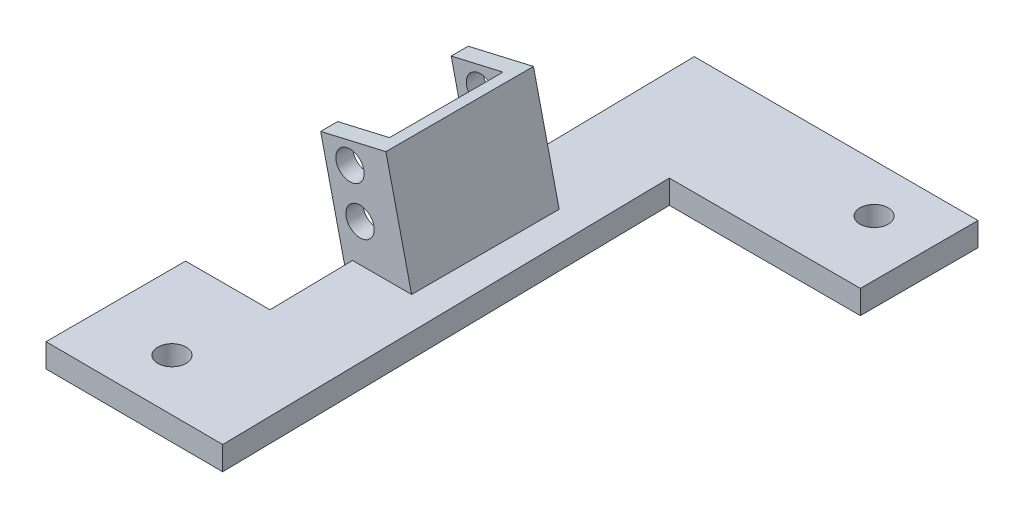
ISO-10303-21;
HEADER;
FILE_DESCRIPTION(('STEP AP214'),'2;1');
FILE_NAME('part.step','',(''),(''),'','','');
FILE_SCHEMA(('AUTOMOTIVE_DESIGN { 1 0 10303 214 1 1 1 1 }'));
ENDSEC;
DATA;
#1=APPLICATION_CONTEXT('core data for automotive mechanical design processes');
#2=APPLICATION_PROTOCOL_DEFINITION('international standard','automotive_design',2000,#1);
#3=PRODUCT_CONTEXT('',#1,'mechanical');
#4=PRODUCT('Part','Part','',(#3));
#5=PRODUCT_RELATED_PRODUCT_CATEGORY('part','',(#4));
#6=PRODUCT_DEFINITION_FORMATION('','',#4);
#7=PRODUCT_DEFINITION_CONTEXT('part definition',#1,'design');
#8=PRODUCT_DEFINITION('design','',#6,#7);
#9=PRODUCT_DEFINITION_SHAPE('','',#8);
#10=(LENGTH_UNIT() NAMED_UNIT(*) SI_UNIT(.MILLI.,.METRE.));
#11=(NAMED_UNIT(*) PLANE_ANGLE_UNIT() SI_UNIT($,.RADIAN.));
#12=(NAMED_UNIT(*) SI_UNIT($,.STERADIAN.) SOLID_ANGLE_UNIT());
#13=UNCERTAINTY_MEASURE_WITH_UNIT(LENGTH_MEASURE(1.E-05),#10,'distance_accuracy_value','');
#14=(GEOMETRIC_REPRESENTATION_CONTEXT(3) GLOBAL_UNCERTAINTY_ASSIGNED_CONTEXT((#13)) GLOBAL_UNIT_ASSIGNED_CONTEXT((#10,
#11,#12)) REPRESENTATION_CONTEXT('',''));
#15=CARTESIAN_POINT('',(0.,0.,0.));
#16=DIRECTION('',(0.,0.,1.));
#17=DIRECTION('',(1.,0.,0.));
#18=AXIS2_PLACEMENT_3D('',#15,#16,#17);
#19=CARTESIAN_POINT('',(356.009914650998,220.257763535313,-29.21));
#20=DIRECTION('',(0.,0.,1.));
#21=DIRECTION('',(1.,0.,0.));
#22=AXIS2_PLACEMENT_3D('',#19,#20,#21);
#23=CYLINDRICAL_SURFACE('',#22,7.57111823234488);
#24=DIRECTION('',(0.,0.,1.));
#25=VECTOR('',#24,1.);
#26=CARTESIAN_POINT('',(362.395514522284,224.325434315007,-29.21));
#27=LINE('',#26,#25);
#28=CARTESIAN_POINT('',(362.395514522284,224.325434315007,-25.3999999999955));
#29=VERTEX_POINT('',#28);
#30=CARTESIAN_POINT('',(362.395514522284,224.325434315007,0.));
#31=VERTEX_POINT('',#30);
#32=EDGE_CURVE('E93',#29,#31,#27,.T.);
#33=ORIENTED_EDGE('',*,*,#32,.F.);
#34=CARTESIAN_POINT('',(356.009914650998,220.257763535313,-25.3999999999955));
#35=DIRECTION('',(0.,0.,1.));
#36=DIRECTION('',(0.,-1.,0.));
#37=AXIS2_PLACEMENT_3D('',#34,#35,#36);
#38=CIRCLE('',#37,7.57111823234488);
#39=CARTESIAN_POINT('',(357.717840229735,212.88180112315,-25.3999999999955));
#40=VERTEX_POINT('',#39);
#41=EDGE_CURVE('E200',#40,#29,#38,.T.);
#42=ORIENTED_EDGE('',*,*,#41,.F.);
#43=DIRECTION('',(0.,0.,1.));
#44=VECTOR('',#43,1.);
#45=CARTESIAN_POINT('',(357.717840229735,212.88180112315,-29.21));
#46=LINE('',#45,#44);
#47=CARTESIAN_POINT('',(357.717840229735,212.88180112315,0.));
#48=VERTEX_POINT('',#47);
#49=EDGE_CURVE('E127',#40,#48,#46,.T.);
#50=ORIENTED_EDGE('',*,*,#49,.T.);
#51=CARTESIAN_POINT('',(356.009914650998,220.257763535313,0.));
#52=DIRECTION('',(0.,0.,1.));
#53=DIRECTION('',(1.,0.,0.));
#54=AXIS2_PLACEMENT_3D('',#51,#52,#53);
#55=CIRCLE('',#54,7.57111823234488);
#56=EDGE_CURVE('E112',#48,#31,#55,.T.);
#57=ORIENTED_EDGE('',*,*,#56,.T.);
#58=EDGE_LOOP('',(#33,#42,#50,#57));
#59=FACE_BOUND('',#58,.T.);
#60=ADVANCED_FACE('F43',(#59),#23,.F.);
#61=CARTESIAN_POINT('',(367.751204122987,227.737045210306,-29.21));
#62=DIRECTION('',(0.,0.,1.));
#63=DIRECTION('',(1.,0.,0.));
#64=AXIS2_PLACEMENT_3D('',#61,#62,#63);
#65=CYLINDRICAL_SURFACE('',#64,6.34999999999995);
#66=CARTESIAN_POINT('',(367.751204122987,227.737045210306,-25.3999999999955));
#67=DIRECTION('',(0.,0.,1.));
#68=DIRECTION('',(0.,-1.,0.));
#69=AXIS2_PLACEMENT_3D('',#66,#67,#68);
#70=CIRCLE('',#69,6.34999999999995);
#71=CARTESIAN_POINT('',(361.482600286885,228.750507565804,-25.3999999999955));
#72=VERTEX_POINT('',#71);
#73=EDGE_CURVE('E197',#29,#72,#70,.F.);
#74=ORIENTED_EDGE('',*,*,#73,.F.);
#75=ORIENTED_EDGE('',*,*,#32,.T.);
#76=CARTESIAN_POINT('',(367.751204122987,227.737045210306,0.));
#77=DIRECTION('',(0.,0.,1.));
#78=DIRECTION('',(1.,0.,0.));
#79=AXIS2_PLACEMENT_3D('',#76,#77,#78);
#80=CIRCLE('',#79,6.34999999999995);
#81=CARTESIAN_POINT('',(361.482600286885,228.750507565804,0.));
#82=VERTEX_POINT('',#81);
#83=EDGE_CURVE('E97',#82,#31,#80,.T.);
#84=ORIENTED_EDGE('',*,*,#83,.F.);
#85=DIRECTION('',(0.,0.,1.));
#86=VECTOR('',#85,1.);
#87=CARTESIAN_POINT('',(361.482600286885,228.750507565804,-29.21));
#88=LINE('',#87,#86);
#89=EDGE_CURVE('E82',#72,#82,#88,.T.);
#90=ORIENTED_EDGE('',*,*,#89,.F.);
#91=EDGE_LOOP('',(#74,#75,#84,#90));
#92=FACE_BOUND('',#91,.T.);
#93=ADVANCED_FACE('F98',(#92),#65,.T.);
#94=CARTESIAN_POINT('',(353.754071423718,230.000000000003,-29.21));
#95=DIRECTION('',(0.,0.,1.));
#96=DIRECTION('',(1.,0.,0.));
#97=AXIS2_PLACEMENT_3D('',#94,#95,#96);
#98=CYLINDRICAL_SURFACE('',#97,7.82888176765517);
#99=DIRECTION('',(0.,0.,1.));
#100=VECTOR('',#99,1.);
#101=CARTESIAN_POINT('',(358.789055406851,235.995025105999,-29.21));
#102=LINE('',#101,#100);
#103=CARTESIAN_POINT('',(358.789055406851,235.995025105999,-25.3999999999955));
#104=VERTEX_POINT('',#103);
#105=CARTESIAN_POINT('',(358.789055406851,235.995025105999,0.));
#106=VERTEX_POINT('',#105);
#107=EDGE_CURVE('E76',#104,#106,#102,.T.);
#108=ORIENTED_EDGE('',*,*,#107,.F.);
#109=CARTESIAN_POINT('',(353.754071423718,230.000000000003,-25.3999999999955));
#110=DIRECTION('',(0.,0.,1.));
#111=DIRECTION('',(0.,-1.,0.));
#112=AXIS2_PLACEMENT_3D('',#109,#110,#111);
#113=CIRCLE('',#112,7.82888176765517);
#114=EDGE_CURVE('E90',#72,#104,#113,.T.);
#115=ORIENTED_EDGE('',*,*,#114,.F.);
#116=ORIENTED_EDGE('',*,*,#89,.T.);
#117=CARTESIAN_POINT('',(353.754071423718,230.000000000003,0.));
#118=DIRECTION('',(0.,0.,1.));
#119=DIRECTION('',(1.,0.,0.));
#120=AXIS2_PLACEMENT_3D('',#117,#118,#119);
#121=CIRCLE('',#120,7.82888176765517);
#122=EDGE_CURVE('E86',#82,#106,#121,.T.);
#123=ORIENTED_EDGE('',*,*,#122,.T.);
#124=EDGE_LOOP('',(#108,#115,#116,#123));
#125=FACE_BOUND('',#124,.T.);
#126=ADVANCED_FACE('F84',(#125),#98,.F.);
#127=CARTESIAN_POINT('',(-33.6063675953166,145.134722073593,-29.21));
#128=DIRECTION('',(-0.225584322727993,0.974223646468999,0.));
#129=DIRECTION('',(-0.974223646468999,-0.225584322727993,0.));
#130=AXIS2_PLACEMENT_3D('',#127,#128,#129);
#131=PLANE('',#130);
#132=ORIENTED_EDGE('',*,*,#107,.T.);
#133=DIRECTION('',(-0.974223646468999,-0.225584322727992,0.));
#134=VECTOR('',#133,1.);
#135=CARTESIAN_POINT('',(-33.6063675953166,145.134722073594,0.));
#136=LINE('',#135,#134);
#137=CARTESIAN_POINT('',(347.192843533049,233.309888473108,0.));
#138=VERTEX_POINT('',#137);
#139=EDGE_CURVE('E108',#106,#138,#136,.T.);
#140=ORIENTED_EDGE('',*,*,#139,.T.);
#141=DIRECTION('',(0.,0.,-1.));
#142=VECTOR('',#141,1.);
#143=CARTESIAN_POINT('',(347.192843533049,233.309888473108,3.81));
#144=LINE('',#143,#142);
#145=CARTESIAN_POINT('',(347.192843533049,233.309888473108,3.81));
#146=VERTEX_POINT('',#145);
#147=EDGE_CURVE('E168',#146,#138,#144,.T.);
#148=ORIENTED_EDGE('',*,*,#147,.F.);
#149=DIRECTION('',(-0.974223646468999,-0.225584322727992,0.));
#150=VECTOR('',#149,1.);
#151=CARTESIAN_POINT('',(-33.6063675953166,145.134722073594,3.81));
#152=LINE('',#151,#150);
#153=CARTESIAN_POINT('',(361.796858989297,236.691490785624,3.81));
#154=VERTEX_POINT('',#153);
#155=EDGE_CURVE('E154',#154,#146,#152,.T.);
#156=ORIENTED_EDGE('',*,*,#155,.F.);
#157=DIRECTION('',(0.,0.,1.));
#158=VECTOR('',#157,1.);
#159=CARTESIAN_POINT('',(361.796858989297,236.691490785624,-29.21));
#160=LINE('',#159,#158);
#161=CARTESIAN_POINT('',(361.796858989297,236.691490785624,-29.21));
#162=VERTEX_POINT('',#161);
#163=EDGE_CURVE('E59',#162,#154,#160,.T.);
#164=ORIENTED_EDGE('',*,*,#163,.F.);
#165=DIRECTION('',(-0.974223646468999,-0.225584322727993,0.));
#166=VECTOR('',#165,1.);
#167=CARTESIAN_POINT('',(-33.6063675953166,145.134722073593,-29.21));
#168=LINE('',#167,#166);
#169=CARTESIAN_POINT('',(347.192843533049,233.309888473108,-29.21));
#170=VERTEX_POINT('',#169);
#171=EDGE_CURVE('E128',#162,#170,#168,.T.);
#172=ORIENTED_EDGE('',*,*,#171,.T.);
#173=DIRECTION('',(0.,0.,-1.));
#174=VECTOR('',#173,1.);
#175=CARTESIAN_POINT('',(347.192843533049,233.309888473108,3.98173268145982));
#176=LINE('',#175,#174);
#177=CARTESIAN_POINT('',(347.192843533049,233.309888473108,-25.3999999999955));
#178=VERTEX_POINT('',#177);
#179=EDGE_CURVE('E182',#178,#170,#176,.T.);
#180=ORIENTED_EDGE('',*,*,#179,.F.);
#181=DIRECTION('',(-0.974223646468999,-0.225584322727992,0.));
#182=VECTOR('',#181,1.);
#183=CARTESIAN_POINT('',(-33.6063675953166,145.134722073594,-25.3999999999955));
#184=LINE('',#183,#182);
#185=EDGE_CURVE('E195',#104,#178,#184,.T.);
#186=ORIENTED_EDGE('',*,*,#185,.F.);
#187=EDGE_LOOP('',(#132,#140,#148,#156,#164,#172,#180,#186));
#188=FACE_BOUND('',#187,.T.);
#189=ADVANCED_FACE('F240',(#188),#131,.T.);
#190=CARTESIAN_POINT('',(395.403226584613,91.5567687120302,-29.21));
#191=DIRECTION('',(0.974223646468999,0.225584322727992,0.));
#192=DIRECTION('',(-0.225584322727992,0.974223646468999,0.));
#193=AXIS2_PLACEMENT_3D('',#190,#191,#192);
#194=PLANE('',#193);
#195=ORIENTED_EDGE('',*,*,#163,.T.);
#196=DIRECTION('',(-0.225584322727992,0.974223646468999,0.));
#197=VECTOR('',#196,1.);
#198=CARTESIAN_POINT('',(395.403226584613,91.5567687120302,3.81));
#199=LINE('',#198,#197);
#200=CARTESIAN_POINT('',(367.54285520891,211.876444589269,3.81));
#201=VERTEX_POINT('',#200);
#202=EDGE_CURVE('E140',#201,#154,#199,.T.);
#203=ORIENTED_EDGE('',*,*,#202,.F.);
#204=DIRECTION('',(0.,0.,1.));
#205=VECTOR('',#204,1.);
#206=CARTESIAN_POINT('',(367.54285520891,211.876444589269,-29.21));
#207=LINE('',#206,#205);
#208=CARTESIAN_POINT('',(367.542855208909,211.876444589269,-29.21));
#209=VERTEX_POINT('',#208);
#210=EDGE_CURVE('E119',#209,#201,#207,.T.);
#211=ORIENTED_EDGE('',*,*,#210,.F.);
#212=DIRECTION('',(-0.225584322727992,0.974223646468999,0.));
#213=VECTOR('',#212,1.);
#214=CARTESIAN_POINT('',(395.403226584613,91.5567687120302,-29.21));
#215=LINE('',#214,#213);
#216=EDGE_CURVE('E218',#209,#162,#215,.T.);
#217=ORIENTED_EDGE('',*,*,#216,.T.);
#218=EDGE_LOOP('',(#195,#203,#211,#217));
#219=FACE_BOUND('',#218,.T.);
#220=ADVANCED_FACE('F150',(#219),#194,.T.);
#221=CARTESIAN_POINT('',(-27.8603713757036,120.319675877239,-29.21));
#222=DIRECTION('',(0.225584322727993,-0.974223646468999,0.));
#223=DIRECTION('',(0.974223646468999,0.225584322727993,0.));
#224=AXIS2_PLACEMENT_3D('',#221,#222,#223);
#225=PLANE('',#224);
#226=DIRECTION('',(-0.0163685007329876,-0.00379017401733859,-0.999858843419746));
#227=VECTOR('',#226,1.);
#228=CARTESIAN_POINT('',(353.688854952463,208.668510480657,-35.7911752243882));
#229=LINE('',#228,#227);
#230=CARTESIAN_POINT('',(354.337158330438,208.818627015986,3.81));
#231=VERTEX_POINT('',#230);
#232=CARTESIAN_POINT('',(353.796594132041,208.693457801475,-29.21));
#233=VERTEX_POINT('',#232);
#234=EDGE_CURVE('E294',#231,#233,#229,.T.);
#235=ORIENTED_EDGE('',*,*,#234,.F.);
#236=DIRECTION('',(0.974223646468999,0.225584322727993,0.));
#237=VECTOR('',#236,1.);
#238=CARTESIAN_POINT('',(-27.8603713757036,120.319675877239,3.81));
#239=LINE('',#238,#237);
#240=CARTESIAN_POINT('',(352.938839752662,208.494842276754,3.81));
#241=VERTEX_POINT('',#240);
#242=EDGE_CURVE('E155',#241,#231,#239,.T.);
#243=ORIENTED_EDGE('',*,*,#242,.F.);
#244=DIRECTION('',(0.,0.,1.));
#245=VECTOR('',#244,1.);
#246=CARTESIAN_POINT('',(352.938839752662,208.494842276754,-29.21));
#247=LINE('',#246,#245);
#248=CARTESIAN_POINT('',(352.938839752662,208.494842276754,-29.21));
#249=VERTEX_POINT('',#248);
#250=EDGE_CURVE('E122',#249,#241,#247,.T.);
#251=ORIENTED_EDGE('',*,*,#250,.F.);
#252=DIRECTION('',(0.974223646468999,0.225584322727993,0.));
#253=VECTOR('',#252,1.);
#254=CARTESIAN_POINT('',(-27.8603713757036,120.319675877239,-29.21));
#255=LINE('',#254,#253);
#256=EDGE_CURVE('E215',#249,#233,#255,.T.);
#257=ORIENTED_EDGE('',*,*,#256,.T.);
#258=EDGE_LOOP('',(#235,#243,#251,#257));
#259=FACE_BOUND('',#258,.T.);
#260=ADVANCED_FACE('F268',(#259),#225,.T.);
#261=CARTESIAN_POINT('',(380.799211128366,88.1751663995147,-29.21));
#262=DIRECTION('',(-0.974223646468999,-0.225584322727992,0.));
#263=DIRECTION('',(0.225584322727992,-0.974223646468999,0.));
#264=AXIS2_PLACEMENT_3D('',#261,#262,#263);
#265=PLANE('',#264);
#266=ORIENTED_EDGE('',*,*,#250,.T.);
#267=DIRECTION('',(0.225584322727987,-0.974223646469,0.));
#268=VECTOR('',#267,1.);
#269=CARTESIAN_POINT('',(380.799211128365,88.1751663995128,3.81));
#270=LINE('',#269,#268);
#271=EDGE_CURVE('E159',#146,#241,#270,.T.);
#272=ORIENTED_EDGE('',*,*,#271,.F.);
#273=ORIENTED_EDGE('',*,*,#147,.T.);
#274=DIRECTION('',(0.225584322727987,-0.974223646469,0.));
#275=VECTOR('',#274,1.);
#276=CARTESIAN_POINT('',(380.799211128365,88.1751663995128,0.));
#277=LINE('',#276,#275);
#278=CARTESIAN_POINT('',(352.217914789273,211.608277369094,0.));
#279=VERTEX_POINT('',#278);
#280=EDGE_CURVE('E169',#138,#279,#277,.T.);
#281=ORIENTED_EDGE('',*,*,#280,.T.);
#282=DIRECTION('',(0.,0.,1.));
#283=VECTOR('',#282,1.);
#284=CARTESIAN_POINT('',(352.217914789273,211.608277369094,-29.21));
#285=LINE('',#284,#283);
#286=CARTESIAN_POINT('',(352.217914789273,211.608277369094,-25.3999999999955));
#287=VERTEX_POINT('',#286);
#288=EDGE_CURVE('E125',#287,#279,#285,.T.);
#289=ORIENTED_EDGE('',*,*,#288,.F.);
#290=DIRECTION('',(0.225584322727992,-0.974223646468999,0.));
#291=VECTOR('',#290,1.);
#292=CARTESIAN_POINT('',(380.799211128366,88.1751663995147,-25.3999999999955));
#293=LINE('',#292,#291);
#294=EDGE_CURVE('E206',#178,#287,#293,.T.);
#295=ORIENTED_EDGE('',*,*,#294,.F.);
#296=ORIENTED_EDGE('',*,*,#179,.T.);
#297=DIRECTION('',(0.225584322727992,-0.974223646468999,0.));
#298=VECTOR('',#297,1.);
#299=CARTESIAN_POINT('',(380.799211128366,88.1751663995147,-29.21));
#300=LINE('',#299,#298);
#301=EDGE_CURVE('E103',#170,#249,#300,.T.);
#302=ORIENTED_EDGE('',*,*,#301,.T.);
#303=EDGE_LOOP('',(#266,#272,#273,#281,#289,#295,#296,#302));
#304=FACE_BOUND('',#303,.T.);
#305=ADVANCED_FACE('F232',(#304),#265,.T.);
#306=CARTESIAN_POINT('',(-28.5812963390924,123.43311096958,-29.21));
#307=DIRECTION('',(0.225584322727992,-0.974223646468999,0.));
#308=DIRECTION('',(0.974223646468999,0.225584322727992,0.));
#309=AXIS2_PLACEMENT_3D('',#306,#307,#308);
#310=PLANE('',#309);
#311=ORIENTED_EDGE('',*,*,#49,.F.);
#312=DIRECTION('',(0.974223646468999,0.225584322727992,0.));
#313=VECTOR('',#312,1.);
#314=CARTESIAN_POINT('',(-28.5812963390924,123.43311096958,-25.3999999999955));
#315=LINE('',#314,#313);
#316=EDGE_CURVE('E203',#287,#40,#315,.T.);
#317=ORIENTED_EDGE('',*,*,#316,.F.);
#318=ORIENTED_EDGE('',*,*,#288,.T.);
#319=DIRECTION('',(0.974223646468999,0.225584322727992,0.));
#320=VECTOR('',#319,1.);
#321=CARTESIAN_POINT('',(-28.5812963390924,123.43311096958,0.));
#322=LINE('',#321,#320);
#323=EDGE_CURVE('E109',#279,#48,#322,.T.);
#324=ORIENTED_EDGE('',*,*,#323,.T.);
#325=EDGE_LOOP('',(#311,#317,#318,#324));
#326=FACE_BOUND('',#325,.T.);
#327=ADVANCED_FACE('F257',(#326),#310,.F.);
#328=CARTESIAN_POINT('',(0.,0.,-29.21));
#329=DIRECTION('',(0.,0.,1.));
#330=DIRECTION('',(1.,0.,0.));
#331=AXIS2_PLACEMENT_3D('',#328,#329,#330);
#332=PLANE('',#331);
#333=DIRECTION('',(1.,0.,0.));
#334=VECTOR('',#333,1.);
#335=CARTESIAN_POINT('',(0.,211.876444589269,-29.21));
#336=LINE('',#335,#334);
#337=CARTESIAN_POINT('',(353.796594132041,211.876444589269,-29.21));
#338=VERTEX_POINT('',#337);
#339=EDGE_CURVE('E300',#338,#209,#336,.T.);
#340=ORIENTED_EDGE('',*,*,#339,.F.);
#341=DIRECTION('',(0.,-1.,0.));
#342=VECTOR('',#341,1.);
#343=CARTESIAN_POINT('',(353.796594132041,1.01857908127033E-13,-29.21));
#344=LINE('',#343,#342);
#345=EDGE_CURVE('E172',#338,#233,#344,.T.);
#346=ORIENTED_EDGE('',*,*,#345,.T.);
#347=ORIENTED_EDGE('',*,*,#256,.F.);
#348=ORIENTED_EDGE('',*,*,#301,.F.);
#349=ORIENTED_EDGE('',*,*,#171,.F.);
#350=ORIENTED_EDGE('',*,*,#216,.F.);
#351=EDGE_LOOP('',(#340,#346,#347,#348,#349,#350));
#352=FACE_BOUND('',#351,.T.);
#353=CARTESIAN_POINT('',(356.009914650998,220.257763535313,-29.21));
#354=DIRECTION('',(0.,0.,-1.));
#355=DIRECTION('',(-1.,0.,0.));
#356=AXIS2_PLACEMENT_3D('',#353,#354,#355);
#357=CIRCLE('',#356,3.17500000000003);
#358=CARTESIAN_POINT('',(352.834914650998,220.257763535313,-29.21));
#359=VERTEX_POINT('',#358);
#360=EDGE_CURVE('E186',#359,#359,#357,.T.);
#361=ORIENTED_EDGE('',*,*,#360,.F.);
#362=EDGE_LOOP('',(#361));
#363=FACE_BOUND('',#362,.T.);
#364=CARTESIAN_POINT('',(353.754071423718,230.000000000003,-29.21));
#365=DIRECTION('',(0.,0.,-1.));
#366=DIRECTION('',(-1.,0.,0.));
#367=AXIS2_PLACEMENT_3D('',#364,#365,#366);
#368=CIRCLE('',#367,3.17499999999997);
#369=CARTESIAN_POINT('',(350.579071423718,230.000000000003,-29.21));
#370=VERTEX_POINT('',#369);
#371=EDGE_CURVE('E183',#370,#370,#368,.T.);
#372=ORIENTED_EDGE('',*,*,#371,.F.);
#373=EDGE_LOOP('',(#372));
#374=FACE_BOUND('',#373,.T.);
#375=ADVANCED_FACE('F259',(#352,#363,#374),#332,.F.);
#376=CARTESIAN_POINT('',(353.754071423718,230.000000000003,3.98173268145982));
#377=DIRECTION('',(0.,0.,-1.));
#378=DIRECTION('',(-1.,0.,0.));
#379=AXIS2_PLACEMENT_3D('',#376,#377,#378);
#380=CYLINDRICAL_SURFACE('',#379,3.17499999999997);
#381=ORIENTED_EDGE('',*,*,#371,.T.);
#382=EDGE_LOOP('',(#381));
#383=FACE_BOUND('',#382,.T.);
#384=CARTESIAN_POINT('',(353.754071423718,230.000000000003,-25.3999999999955));
#385=DIRECTION('',(0.,0.,1.));
#386=DIRECTION('',(0.,-1.,0.));
#387=AXIS2_PLACEMENT_3D('',#384,#385,#386);
#388=CIRCLE('',#387,3.17499999999997);
#389=CARTESIAN_POINT('',(353.754071423718,226.825000000003,-25.3999999999955));
#390=VERTEX_POINT('',#389);
#391=EDGE_CURVE('E190',#390,#390,#388,.F.);
#392=ORIENTED_EDGE('',*,*,#391,.F.);
#393=EDGE_LOOP('',(#392));
#394=FACE_BOUND('',#393,.T.);
#395=ADVANCED_FACE('F265',(#383,#394),#380,.F.);
#396=CARTESIAN_POINT('',(356.009914650998,220.257763535313,3.98173268145982));
#397=DIRECTION('',(0.,0.,-1.));
#398=DIRECTION('',(-1.,0.,0.));
#399=AXIS2_PLACEMENT_3D('',#396,#397,#398);
#400=CYLINDRICAL_SURFACE('',#399,3.17500000000003);
#401=ORIENTED_EDGE('',*,*,#360,.T.);
#402=EDGE_LOOP('',(#401));
#403=FACE_BOUND('',#402,.T.);
#404=CARTESIAN_POINT('',(356.009914650998,220.257763535313,-25.3999999999955));
#405=DIRECTION('',(0.,0.,1.));
#406=DIRECTION('',(0.,-1.,0.));
#407=AXIS2_PLACEMENT_3D('',#404,#405,#406);
#408=CIRCLE('',#407,3.17500000000003);
#409=CARTESIAN_POINT('',(356.009914650998,217.082763535313,-25.3999999999955));
#410=VERTEX_POINT('',#409);
#411=EDGE_CURVE('E189',#410,#410,#408,.F.);
#412=ORIENTED_EDGE('',*,*,#411,.F.);
#413=EDGE_LOOP('',(#412));
#414=FACE_BOUND('',#413,.T.);
#415=ADVANCED_FACE('F520',(#403,#414),#400,.F.);
#416=CARTESIAN_POINT('',(320.662320290685,227.166668547247,-25.3999999999955));
#417=DIRECTION('',(0.,0.,1.));
#418=DIRECTION('',(1.,0.,0.));
#419=AXIS2_PLACEMENT_3D('',#416,#417,#418);
#420=PLANE('',#419);
#421=ORIENTED_EDGE('',*,*,#411,.T.);
#422=EDGE_LOOP('',(#421));
#423=FACE_BOUND('',#422,.T.);
#424=ORIENTED_EDGE('',*,*,#185,.T.);
#425=ORIENTED_EDGE('',*,*,#294,.T.);
#426=ORIENTED_EDGE('',*,*,#316,.T.);
#427=ORIENTED_EDGE('',*,*,#41,.T.);
#428=ORIENTED_EDGE('',*,*,#73,.T.);
#429=ORIENTED_EDGE('',*,*,#114,.T.);
#430=EDGE_LOOP('',(#424,#425,#426,#427,#428,#429));
#431=FACE_BOUND('',#430,.T.);
#432=ORIENTED_EDGE('',*,*,#391,.T.);
#433=EDGE_LOOP('',(#432));
#434=FACE_BOUND('',#433,.T.);
#435=ADVANCED_FACE('F255',(#423,#431,#434),#420,.T.);
#436=CARTESIAN_POINT('',(0.,0.,0.));
#437=DIRECTION('',(0.,0.,1.));
#438=DIRECTION('',(1.,0.,0.));
#439=AXIS2_PLACEMENT_3D('',#436,#437,#438);
#440=PLANE('',#439);
#441=CARTESIAN_POINT('',(356.009914650998,220.257763535313,0.));
#442=DIRECTION('',(0.,0.,1.));
#443=DIRECTION('',(1.,0.,0.));
#444=AXIS2_PLACEMENT_3D('',#441,#442,#443);
#445=CIRCLE('',#444,3.17500000000003);
#446=CARTESIAN_POINT('',(352.834914650998,220.257763535313,0.));
#447=VERTEX_POINT('',#446);
#448=EDGE_CURVE('E177',#447,#447,#445,.T.);
#449=ORIENTED_EDGE('',*,*,#448,.T.);
#450=EDGE_LOOP('',(#449));
#451=FACE_BOUND('',#450,.T.);
#452=CARTESIAN_POINT('',(353.754071423718,230.000000000003,0.));
#453=DIRECTION('',(0.,0.,1.));
#454=DIRECTION('',(1.,0.,0.));
#455=AXIS2_PLACEMENT_3D('',#452,#453,#454);
#456=CIRCLE('',#455,3.17499999999997);
#457=CARTESIAN_POINT('',(350.579071423718,230.000000000003,0.));
#458=VERTEX_POINT('',#457);
#459=EDGE_CURVE('E174',#458,#458,#456,.T.);
#460=ORIENTED_EDGE('',*,*,#459,.T.);
#461=EDGE_LOOP('',(#460));
#462=FACE_BOUND('',#461,.T.);
#463=ORIENTED_EDGE('',*,*,#323,.F.);
#464=ORIENTED_EDGE('',*,*,#280,.F.);
#465=ORIENTED_EDGE('',*,*,#139,.F.);
#466=ORIENTED_EDGE('',*,*,#122,.F.);
#467=ORIENTED_EDGE('',*,*,#83,.T.);
#468=ORIENTED_EDGE('',*,*,#56,.F.);
#469=EDGE_LOOP('',(#463,#464,#465,#466,#467,#468));
#470=FACE_BOUND('',#469,.T.);
#471=ADVANCED_FACE('F106',(#451,#462,#470),#440,.F.);
#472=CARTESIAN_POINT('',(353.754071423718,230.000000000003,3.81));
#473=DIRECTION('',(0.,0.,-1.));
#474=DIRECTION('',(-1.,0.,0.));
#475=AXIS2_PLACEMENT_3D('',#472,#473,#474);
#476=CYLINDRICAL_SURFACE('',#475,3.17499999999997);
#477=CARTESIAN_POINT('',(353.754071423718,230.000000000003,3.81));
#478=DIRECTION('',(0.,0.,1.));
#479=DIRECTION('',(1.,0.,0.));
#480=AXIS2_PLACEMENT_3D('',#477,#478,#479);
#481=CIRCLE('',#480,3.17499999999997);
#482=CARTESIAN_POINT('',(350.579071423718,230.000000000003,3.81));
#483=VERTEX_POINT('',#482);
#484=EDGE_CURVE('E157',#483,#483,#481,.T.);
#485=CARTESIAN_POINT('',(350.579071423718,230.000000000003,3.81));
#486=CARTESIAN_POINT('',(350.579071423718,230.000000000003,3.7703125));
#487=CARTESIAN_POINT('',(350.579071423718,230.000000000003,3.730625));
#488=CARTESIAN_POINT('',(350.579071423718,230.000000000003,3.65125));
#489=CARTESIAN_POINT('',(350.579071423718,230.000000000003,3.6115625));
#490=CARTESIAN_POINT('',(350.579071423718,230.000000000003,3.5321875));
#491=CARTESIAN_POINT('',(350.579071423718,230.000000000003,3.4925));
#492=CARTESIAN_POINT('',(350.579071423718,230.000000000003,3.413125));
#493=CARTESIAN_POINT('',(350.579071423718,230.000000000003,3.3734375));
#494=CARTESIAN_POINT('',(350.579071423718,230.000000000003,3.2940625));
#495=CARTESIAN_POINT('',(350.579071423718,230.000000000003,3.254375));
#496=CARTESIAN_POINT('',(350.579071423718,230.000000000003,3.175));
#497=CARTESIAN_POINT('',(350.579071423718,230.000000000003,3.1353125));
#498=CARTESIAN_POINT('',(350.579071423718,230.000000000003,3.0559375));
#499=CARTESIAN_POINT('',(350.579071423718,230.000000000003,3.01625));
#500=CARTESIAN_POINT('',(350.579071423718,230.000000000003,2.936875));
#501=CARTESIAN_POINT('',(350.579071423718,230.000000000003,2.8971875));
#502=CARTESIAN_POINT('',(350.579071423718,230.000000000003,2.8178125));
#503=CARTESIAN_POINT('',(350.579071423718,230.000000000003,2.778125));
#504=CARTESIAN_POINT('',(350.579071423718,230.000000000003,2.69875));
#505=CARTESIAN_POINT('',(350.579071423718,230.000000000003,2.6590625));
#506=CARTESIAN_POINT('',(350.579071423718,230.000000000003,2.5796875));
#507=CARTESIAN_POINT('',(350.579071423718,230.000000000003,2.54));
#508=CARTESIAN_POINT('',(350.579071423718,230.000000000003,2.460625));
#509=CARTESIAN_POINT('',(350.579071423718,230.000000000003,2.4209375));
#510=CARTESIAN_POINT('',(350.579071423718,230.000000000003,2.3415625));
#511=CARTESIAN_POINT('',(350.579071423718,230.000000000003,2.301875));
#512=CARTESIAN_POINT('',(350.579071423718,230.000000000003,2.2225));
#513=CARTESIAN_POINT('',(350.579071423718,230.000000000003,2.1828125));
#514=CARTESIAN_POINT('',(350.579071423718,230.000000000003,2.1034375));
#515=CARTESIAN_POINT('',(350.579071423718,230.000000000003,2.06375));
#516=CARTESIAN_POINT('',(350.579071423718,230.000000000003,1.984375));
#517=CARTESIAN_POINT('',(350.579071423718,230.000000000003,1.9446875));
#518=CARTESIAN_POINT('',(350.579071423718,230.000000000003,1.8653125));
#519=CARTESIAN_POINT('',(350.579071423718,230.000000000003,1.825625));
#520=CARTESIAN_POINT('',(350.579071423718,230.000000000003,1.74625));
#521=CARTESIAN_POINT('',(350.579071423718,230.000000000003,1.7065625));
#522=CARTESIAN_POINT('',(350.579071423718,230.000000000003,1.6271875));
#523=CARTESIAN_POINT('',(350.579071423718,230.000000000003,1.5875));
#524=CARTESIAN_POINT('',(350.579071423718,230.000000000003,1.508125));
#525=CARTESIAN_POINT('',(350.579071423718,230.000000000003,1.4684375));
#526=CARTESIAN_POINT('',(350.579071423718,230.000000000003,1.3890625));
#527=CARTESIAN_POINT('',(350.579071423718,230.000000000003,1.349375));
#528=CARTESIAN_POINT('',(350.579071423718,230.000000000003,1.27));
#529=CARTESIAN_POINT('',(350.579071423718,230.000000000003,1.2303125));
#530=CARTESIAN_POINT('',(350.579071423718,230.000000000003,1.1509375));
#531=CARTESIAN_POINT('',(350.579071423718,230.000000000003,1.11125));
#532=CARTESIAN_POINT('',(350.579071423718,230.000000000003,1.031875));
#533=CARTESIAN_POINT('',(350.579071423718,230.000000000003,0.9921875));
#534=CARTESIAN_POINT('',(350.579071423718,230.000000000003,0.9128125));
#535=CARTESIAN_POINT('',(350.579071423718,230.000000000003,0.873125));
#536=CARTESIAN_POINT('',(350.579071423718,230.000000000003,0.79375));
#537=CARTESIAN_POINT('',(350.579071423718,230.000000000003,0.7540625));
#538=CARTESIAN_POINT('',(350.579071423718,230.000000000003,0.6746875));
#539=CARTESIAN_POINT('',(350.579071423718,230.000000000003,0.635));
#540=CARTESIAN_POINT('',(350.579071423718,230.000000000003,0.555625));
#541=CARTESIAN_POINT('',(350.579071423718,230.000000000003,0.5159375));
#542=CARTESIAN_POINT('',(350.579071423718,230.000000000003,0.4365625));
#543=CARTESIAN_POINT('',(350.579071423718,230.000000000003,0.396875));
#544=CARTESIAN_POINT('',(350.579071423718,230.000000000003,0.3175));
#545=CARTESIAN_POINT('',(350.579071423718,230.000000000003,0.2778125));
#546=CARTESIAN_POINT('',(350.579071423718,230.000000000003,0.1984375));
#547=CARTESIAN_POINT('',(350.579071423718,230.000000000003,0.15875));
#548=CARTESIAN_POINT('',(350.579071423718,230.000000000003,0.0793749999999999));
#549=CARTESIAN_POINT('',(350.579071423718,230.000000000003,0.0396874999999999));
#550=CARTESIAN_POINT('',(350.579071423718,230.000000000003,0.));
#551=B_SPLINE_CURVE_WITH_KNOTS('',3,(#485,#486,#487,#488,#489,#490,#491,#492,#493,#494,#495,
#496,#497,#498,#499,#500,#501,#502,#503,#504,#505,#506,#507,#508,#509,#510,#511,#512,#513,#514,
#515,#516,#517,#518,#519,#520,#521,#522,#523,#524,#525,#526,#527,#528,#529,#530,#531,#532,#533,
#534,#535,#536,#537,#538,#539,#540,#541,#542,#543,#544,#545,#546,#547,#548,#549,#550),
.UNSPECIFIED.,.F.,.F.,(4,2,2,2,2,2,2,2,2,2,2,2,2,2,2,2,2,2,2,2,2,2,2,2,2,2,2,2,2,2,2,2,4),(0.,
0.1190625,0.238125,0.3571875,0.47625,0.595312499999999,0.714375,0.833437499999999,
0.952499999999999,1.0715625,1.190625,1.3096875,1.42875,1.5478125,1.666875,1.7859375,1.905,
2.0240625,2.143125,2.2621875,2.38125,2.5003125,2.619375,2.7384375,2.8575,2.9765625,3.095625,
3.2146875,3.33375,3.4528125,3.571875,3.6909375,3.81),.UNSPECIFIED.);
#552=EDGE_CURVE('BSEAM510',#483,#458,#551,.T.);
#553=ORIENTED_EDGE('',*,*,#484,.T.);
#554=ORIENTED_EDGE('',*,*,#459,.F.);
#555=ORIENTED_EDGE('',*,*,#552,.T.);
#556=ORIENTED_EDGE('',*,*,#552,.F.);
#557=EDGE_LOOP('',(#553,#555,#554,#556));
#558=FACE_BOUND('',#557,.T.);
#559=ADVANCED_FACE('F510',(#558),#476,.F.);
#560=CARTESIAN_POINT('',(356.009914650998,220.257763535313,3.81));
#561=DIRECTION('',(0.,0.,-1.));
#562=DIRECTION('',(-1.,0.,0.));
#563=AXIS2_PLACEMENT_3D('',#560,#561,#562);
#564=CYLINDRICAL_SURFACE('',#563,3.17500000000003);
#565=CARTESIAN_POINT('',(356.009914650998,220.257763535313,3.81));
#566=DIRECTION('',(0.,0.,1.));
#567=DIRECTION('',(1.,0.,0.));
#568=AXIS2_PLACEMENT_3D('',#565,#566,#567);
#569=CIRCLE('',#568,3.17500000000003);
#570=CARTESIAN_POINT('',(352.834914650998,220.257763535313,3.81));
#571=VERTEX_POINT('',#570);
#572=EDGE_CURVE('E165',#571,#571,#569,.T.);
#573=CARTESIAN_POINT('',(352.834914650998,220.257763535313,3.81));
#574=CARTESIAN_POINT('',(352.834914650998,220.257763535313,3.7703125));
#575=CARTESIAN_POINT('',(352.834914650998,220.257763535313,3.730625));
#576=CARTESIAN_POINT('',(352.834914650998,220.257763535313,3.65125));
#577=CARTESIAN_POINT('',(352.834914650998,220.257763535313,3.6115625));
#578=CARTESIAN_POINT('',(352.834914650998,220.257763535313,3.5321875));
#579=CARTESIAN_POINT('',(352.834914650998,220.257763535313,3.4925));
#580=CARTESIAN_POINT('',(352.834914650998,220.257763535313,3.413125));
#581=CARTESIAN_POINT('',(352.834914650998,220.257763535313,3.3734375));
#582=CARTESIAN_POINT('',(352.834914650998,220.257763535313,3.2940625));
#583=CARTESIAN_POINT('',(352.834914650998,220.257763535313,3.254375));
#584=CARTESIAN_POINT('',(352.834914650998,220.257763535313,3.175));
#585=CARTESIAN_POINT('',(352.834914650998,220.257763535313,3.1353125));
#586=CARTESIAN_POINT('',(352.834914650998,220.257763535313,3.0559375));
#587=CARTESIAN_POINT('',(352.834914650998,220.257763535313,3.01625));
#588=CARTESIAN_POINT('',(352.834914650998,220.257763535313,2.936875));
#589=CARTESIAN_POINT('',(352.834914650998,220.257763535313,2.8971875));
#590=CARTESIAN_POINT('',(352.834914650998,220.257763535313,2.8178125));
#591=CARTESIAN_POINT('',(352.834914650998,220.257763535313,2.778125));
#592=CARTESIAN_POINT('',(352.834914650998,220.257763535313,2.69875));
#593=CARTESIAN_POINT('',(352.834914650998,220.257763535313,2.6590625));
#594=CARTESIAN_POINT('',(352.834914650998,220.257763535313,2.5796875));
#595=CARTESIAN_POINT('',(352.834914650998,220.257763535313,2.54));
#596=CARTESIAN_POINT('',(352.834914650998,220.257763535313,2.460625));
#597=CARTESIAN_POINT('',(352.834914650998,220.257763535313,2.4209375));
#598=CARTESIAN_POINT('',(352.834914650998,220.257763535313,2.3415625));
#599=CARTESIAN_POINT('',(352.834914650998,220.257763535313,2.301875));
#600=CARTESIAN_POINT('',(352.834914650998,220.257763535313,2.2225));
#601=CARTESIAN_POINT('',(352.834914650998,220.257763535313,2.1828125));
#602=CARTESIAN_POINT('',(352.834914650998,220.257763535313,2.1034375));
#603=CARTESIAN_POINT('',(352.834914650998,220.257763535313,2.06375));
#604=CARTESIAN_POINT('',(352.834914650998,220.257763535313,1.984375));
#605=CARTESIAN_POINT('',(352.834914650998,220.257763535313,1.9446875));
#606=CARTESIAN_POINT('',(352.834914650998,220.257763535313,1.8653125));
#607=CARTESIAN_POINT('',(352.834914650998,220.257763535313,1.825625));
#608=CARTESIAN_POINT('',(352.834914650998,220.257763535313,1.74625));
#609=CARTESIAN_POINT('',(352.834914650998,220.257763535313,1.7065625));
#610=CARTESIAN_POINT('',(352.834914650998,220.257763535313,1.6271875));
#611=CARTESIAN_POINT('',(352.834914650998,220.257763535313,1.5875));
#612=CARTESIAN_POINT('',(352.834914650998,220.257763535313,1.508125));
#613=CARTESIAN_POINT('',(352.834914650998,220.257763535313,1.4684375));
#614=CARTESIAN_POINT('',(352.834914650998,220.257763535313,1.3890625));
#615=CARTESIAN_POINT('',(352.834914650998,220.257763535313,1.349375));
#616=CARTESIAN_POINT('',(352.834914650998,220.257763535313,1.27));
#617=CARTESIAN_POINT('',(352.834914650998,220.257763535313,1.2303125));
#618=CARTESIAN_POINT('',(352.834914650998,220.257763535313,1.1509375));
#619=CARTESIAN_POINT('',(352.834914650998,220.257763535313,1.11125));
#620=CARTESIAN_POINT('',(352.834914650998,220.257763535313,1.031875));
#621=CARTESIAN_POINT('',(352.834914650998,220.257763535313,0.9921875));
#622=CARTESIAN_POINT('',(352.834914650998,220.257763535313,0.9128125));
#623=CARTESIAN_POINT('',(352.834914650998,220.257763535313,0.873125));
#624=CARTESIAN_POINT('',(352.834914650998,220.257763535313,0.79375));
#625=CARTESIAN_POINT('',(352.834914650998,220.257763535313,0.7540625));
#626=CARTESIAN_POINT('',(352.834914650998,220.257763535313,0.6746875));
#627=CARTESIAN_POINT('',(352.834914650998,220.257763535313,0.635));
#628=CARTESIAN_POINT('',(352.834914650998,220.257763535313,0.555625));
#629=CARTESIAN_POINT('',(352.834914650998,220.257763535313,0.5159375));
#630=CARTESIAN_POINT('',(352.834914650998,220.257763535313,0.4365625));
#631=CARTESIAN_POINT('',(352.834914650998,220.257763535313,0.396875));
#632=CARTESIAN_POINT('',(352.834914650998,220.257763535313,0.3175));
#633=CARTESIAN_POINT('',(352.834914650998,220.257763535313,0.2778125));
#634=CARTESIAN_POINT('',(352.834914650998,220.257763535313,0.1984375));
#635=CARTESIAN_POINT('',(352.834914650998,220.257763535313,0.15875));
#636=CARTESIAN_POINT('',(352.834914650998,220.257763535313,0.0793749999999999));
#637=CARTESIAN_POINT('',(352.834914650998,220.257763535313,0.0396874999999999));
#638=CARTESIAN_POINT('',(352.834914650998,220.257763535313,0.));
#639=B_SPLINE_CURVE_WITH_KNOTS('',3,(#573,#574,#575,#576,#577,#578,#579,#580,#581,#582,#583,
#584,#585,#586,#587,#588,#589,#590,#591,#592,#593,#594,#595,#596,#597,#598,#599,#600,#601,#602,
#603,#604,#605,#606,#607,#608,#609,#610,#611,#612,#613,#614,#615,#616,#617,#618,#619,#620,#621,
#622,#623,#624,#625,#626,#627,#628,#629,#630,#631,#632,#633,#634,#635,#636,#637,#638),
.UNSPECIFIED.,.F.,.F.,(4,2,2,2,2,2,2,2,2,2,2,2,2,2,2,2,2,2,2,2,2,2,2,2,2,2,2,2,2,2,2,2,4),(0.,
0.1190625,0.238125,0.3571875,0.47625,0.595312499999999,0.714375,0.833437499999999,
0.952499999999999,1.0715625,1.190625,1.3096875,1.42875,1.5478125,1.666875,1.7859375,1.905,
2.0240625,2.143125,2.2621875,2.38125,2.5003125,2.619375,2.7384375,2.8575,2.9765625,3.095625,
3.2146875,3.33375,3.4528125,3.571875,3.6909375,3.81),.UNSPECIFIED.);
#640=EDGE_CURVE('BSEAM508',#571,#447,#639,.T.);
#641=ORIENTED_EDGE('',*,*,#572,.T.);
#642=ORIENTED_EDGE('',*,*,#448,.F.);
#643=ORIENTED_EDGE('',*,*,#640,.T.);
#644=ORIENTED_EDGE('',*,*,#640,.F.);
#645=EDGE_LOOP('',(#641,#643,#642,#644));
#646=FACE_BOUND('',#645,.T.);
#647=ADVANCED_FACE('F508',(#646),#564,.F.);
#648=CARTESIAN_POINT('',(0.,0.,3.81));
#649=DIRECTION('',(0.,0.,1.));
#650=DIRECTION('',(1.,0.,0.));
#651=AXIS2_PLACEMENT_3D('',#648,#649,#650);
#652=PLANE('',#651);
#653=DIRECTION('',(0.,-1.,0.));
#654=VECTOR('',#653,1.);
#655=CARTESIAN_POINT('',(354.337158330438,1.02013536359103E-13,3.81));
#656=LINE('',#655,#654);
#657=CARTESIAN_POINT('',(354.337158330438,211.876444589269,3.81));
#658=VERTEX_POINT('',#657);
#659=EDGE_CURVE('E11',#658,#231,#656,.T.);
#660=ORIENTED_EDGE('',*,*,#659,.F.);
#661=DIRECTION('',(1.,0.,0.));
#662=VECTOR('',#661,1.);
#663=CARTESIAN_POINT('',(0.,211.876444589269,3.81));
#664=LINE('',#663,#662);
#665=EDGE_CURVE('E51',#658,#201,#664,.T.);
#666=ORIENTED_EDGE('',*,*,#665,.T.);
#667=ORIENTED_EDGE('',*,*,#202,.T.);
#668=ORIENTED_EDGE('',*,*,#155,.T.);
#669=ORIENTED_EDGE('',*,*,#271,.T.);
#670=ORIENTED_EDGE('',*,*,#242,.T.);
#671=EDGE_LOOP('',(#660,#666,#667,#668,#669,#670));
#672=FACE_BOUND('',#671,.T.);
#673=ORIENTED_EDGE('',*,*,#484,.F.);
#674=EDGE_LOOP('',(#673));
#675=FACE_BOUND('',#674,.T.);
#676=ORIENTED_EDGE('',*,*,#572,.F.);
#677=EDGE_LOOP('',(#676));
#678=FACE_BOUND('',#677,.T.);
#679=ADVANCED_FACE('F136',(#672,#675,#678),#652,.T.);
#680=CARTESIAN_POINT('',(354.644965942685,206.587123189269,22.6122206919254));
#681=DIRECTION('',(-0.999866025192777,0.,0.0163686183044407));
#682=DIRECTION('',(0.0163686183044407,0.,0.999866025192777));
#683=AXIS2_PLACEMENT_3D('',#680,#681,#682);
#684=PLANE('',#683);
#685=ORIENTED_EDGE('',*,*,#345,.F.);
#686=DIRECTION('',(0.0163686183044407,0.,0.999866025192777));
#687=VECTOR('',#686,1.);
#688=CARTESIAN_POINT('',(354.644965942685,211.876444589269,22.6122206919254));
#689=LINE('',#688,#687);
#690=CARTESIAN_POINT('',(353.06485520891,211.876444589269,-73.9077793080746));
#691=VERTEX_POINT('',#690);
#692=EDGE_CURVE('E354',#691,#338,#689,.T.);
#693=ORIENTED_EDGE('',*,*,#692,.F.);
#694=DIRECTION('',(0.,1.,0.));
#695=VECTOR('',#694,1.);
#696=CARTESIAN_POINT('',(353.06485520891,206.587123189269,-73.9077793080746));
#697=LINE('',#696,#695);
#698=CARTESIAN_POINT('',(353.06485520891,206.587123189269,-73.9077793080746));
#699=VERTEX_POINT('',#698);
#700=EDGE_CURVE('E307',#699,#691,#697,.T.);
#701=ORIENTED_EDGE('',*,*,#700,.F.);
#702=DIRECTION('',(0.0163686183044407,0.,0.999866025192777));
#703=VECTOR('',#702,1.);
#704=CARTESIAN_POINT('',(354.644965942685,206.587123189269,22.6122206919254));
#705=LINE('',#704,#703);
#706=CARTESIAN_POINT('',(354.644965942685,206.587123189269,22.6122206919254));
#707=VERTEX_POINT('',#706);
#708=EDGE_CURVE('E335',#699,#707,#705,.T.);
#709=ORIENTED_EDGE('',*,*,#708,.T.);
#710=DIRECTION('',(0.,1.,0.));
#711=VECTOR('',#710,1.);
#712=CARTESIAN_POINT('',(354.644965942685,206.587123189269,22.6122206919254));
#713=LINE('',#712,#711);
#714=CARTESIAN_POINT('',(354.644965942685,211.876444589269,22.6122206919254));
#715=VERTEX_POINT('',#714);
#716=EDGE_CURVE('E308',#707,#715,#713,.T.);
#717=ORIENTED_EDGE('',*,*,#716,.T.);
#718=EDGE_CURVE('E357',#658,#715,#689,.T.);
#719=ORIENTED_EDGE('',*,*,#718,.F.);
#720=ORIENTED_EDGE('',*,*,#659,.T.);
#721=ORIENTED_EDGE('',*,*,#234,.T.);
#722=EDGE_LOOP('',(#685,#693,#701,#709,#717,#719,#720,#721));
#723=FACE_BOUND('',#722,.T.);
#724=ADVANCED_FACE('F407',(#723),#684,.T.);
#725=CARTESIAN_POINT('',(0.,211.876444589269,-8.51473300979911E-13));
#726=DIRECTION('',(0.,-1.,0.));
#727=DIRECTION('',(0.,0.,-1.));
#728=AXIS2_PLACEMENT_3D('',#725,#726,#727);
#729=PLANE('',#728);
#730=CARTESIAN_POINT('',(352.497558450132,211.876444589269,42.3935320449496));
#731=DIRECTION('',(0.,1.,0.));
#732=DIRECTION('',(0.,0.,1.));
#733=AXIS2_PLACEMENT_3D('',#730,#731,#732);
#734=CIRCLE('',#733,3.17499999999997);
#735=CARTESIAN_POINT('',(352.497558450132,211.876444589269,45.5685320449496));
#736=VERTEX_POINT('',#735);
#737=EDGE_CURVE('E387',#736,#736,#734,.T.);
#738=ORIENTED_EDGE('',*,*,#737,.F.);
#739=EDGE_LOOP('',(#738));
#740=FACE_BOUND('',#739,.T.);
#741=CARTESIAN_POINT('',(404.073297936379,211.876444589269,-63.1493032696403));
#742=DIRECTION('',(0.,1.,0.));
#743=DIRECTION('',(0.,0.,1.));
#744=AXIS2_PLACEMENT_3D('',#741,#742,#743);
#745=CIRCLE('',#744,3.17499999999997);
#746=CARTESIAN_POINT('',(404.073297936379,211.876444589269,-59.9743032696403));
#747=VERTEX_POINT('',#746);
#748=EDGE_CURVE('E380',#747,#747,#745,.T.);
#749=ORIENTED_EDGE('',*,*,#748,.F.);
#750=EDGE_LOOP('',(#749));
#751=FACE_BOUND('',#750,.T.);
#752=ORIENTED_EDGE('',*,*,#692,.T.);
#753=ORIENTED_EDGE('',*,*,#339,.T.);
#754=ORIENTED_EDGE('',*,*,#210,.T.);
#755=ORIENTED_EDGE('',*,*,#665,.F.);
#756=ORIENTED_EDGE('',*,*,#718,.T.);
#757=DIRECTION('',(-1.,0.,0.));
#758=VECTOR('',#757,1.);
#759=CARTESIAN_POINT('',(335.779852437018,211.876444589269,22.6122206919258));
#760=LINE('',#759,#758);
#761=CARTESIAN_POINT('',(335.779852437018,211.876444589269,22.6122206919258));
#762=VERTEX_POINT('',#761);
#763=EDGE_CURVE('E351',#715,#762,#760,.T.);
#764=ORIENTED_EDGE('',*,*,#763,.T.);
#765=DIRECTION('',(0.,0.,1.));
#766=VECTOR('',#765,1.);
#767=CARTESIAN_POINT('',(335.779852437018,211.87644458927,53.8513776506243));
#768=LINE('',#767,#766);
#769=CARTESIAN_POINT('',(335.779852437018,211.87644458927,53.8513776506243));
#770=VERTEX_POINT('',#769);
#771=EDGE_CURVE('E348',#762,#770,#768,.T.);
#772=ORIENTED_EDGE('',*,*,#771,.T.);
#773=DIRECTION('',(0.999991995810644,0.,0.00400103919564825));
#774=VECTOR('',#773,1.);
#775=CARTESIAN_POINT('',(335.779852437018,211.87644458927,53.8513776506243));
#776=LINE('',#775,#774);
#777=CARTESIAN_POINT('',(375.47762636545,211.87644458927,54.0102112714263));
#778=VERTEX_POINT('',#777);
#779=EDGE_CURVE('E345',#770,#778,#776,.T.);
#780=ORIENTED_EDGE('',*,*,#779,.T.);
#781=DIRECTION('',(-0.0163686183044407,0.,-0.999866025192777));
#782=VECTOR('',#781,1.);
#783=CARTESIAN_POINT('',(373.814351908844,211.876444589269,-47.5897887285737));
#784=LINE('',#783,#782);
#785=CARTESIAN_POINT('',(373.814351908844,211.876444589269,-47.5897887285737));
#786=VERTEX_POINT('',#785);
#787=EDGE_CURVE('E342',#778,#786,#784,.T.);
#788=ORIENTED_EDGE('',*,*,#787,.T.);
#789=DIRECTION('',(1.,0.,0.));
#790=VECTOR('',#789,1.);
#791=CARTESIAN_POINT('',(416.56485520891,211.876444589269,-47.5897887285737));
#792=LINE('',#791,#790);
#793=CARTESIAN_POINT('',(416.56485520891,211.876444589269,-47.5897887285737));
#794=VERTEX_POINT('',#793);
#795=EDGE_CURVE('E339',#786,#794,#792,.T.);
#796=ORIENTED_EDGE('',*,*,#795,.T.);
#797=DIRECTION('',(0.,0.,-1.));
#798=VECTOR('',#797,1.);
#799=CARTESIAN_POINT('',(416.56485520891,211.876444589269,-73.9077793080752));
#800=LINE('',#799,#798);
#801=CARTESIAN_POINT('',(416.56485520891,211.876444589269,-73.9077793080752));
#802=VERTEX_POINT('',#801);
#803=EDGE_CURVE('E336',#794,#802,#800,.T.);
#804=ORIENTED_EDGE('',*,*,#803,.T.);
#805=DIRECTION('',(-1.,0.,0.));
#806=VECTOR('',#805,1.);
#807=CARTESIAN_POINT('',(353.06485520891,211.876444589269,-73.9077793080746));
#808=LINE('',#807,#806);
#809=EDGE_CURVE('E332',#802,#691,#808,.T.);
#810=ORIENTED_EDGE('',*,*,#809,.T.);
#811=EDGE_LOOP('',(#752,#753,#754,#755,#756,#764,#772,#780,#788,#796,#804,#810));
#812=FACE_BOUND('',#811,.T.);
#813=ADVANCED_FACE('F403',(#740,#751,#812),#729,.F.);
#814=CARTESIAN_POINT('',(353.06485520891,206.587123189269,-73.9077793080746));
#815=DIRECTION('',(0.,0.,-1.));
#816=DIRECTION('',(-1.,0.,0.));
#817=AXIS2_PLACEMENT_3D('',#814,#815,#816);
#818=PLANE('',#817);
#819=ORIENTED_EDGE('',*,*,#809,.F.);
#820=DIRECTION('',(0.,1.,0.));
#821=VECTOR('',#820,1.);
#822=CARTESIAN_POINT('',(416.56485520891,206.587123189269,-73.9077793080752));
#823=LINE('',#822,#821);
#824=CARTESIAN_POINT('',(416.56485520891,206.587123189269,-73.9077793080752));
#825=VERTEX_POINT('',#824);
#826=EDGE_CURVE('E327',#825,#802,#823,.T.);
#827=ORIENTED_EDGE('',*,*,#826,.F.);
#828=DIRECTION('',(-1.,0.,0.));
#829=VECTOR('',#828,1.);
#830=CARTESIAN_POINT('',(353.06485520891,206.587123189269,-73.9077793080746));
#831=LINE('',#830,#829);
#832=EDGE_CURVE('E312',#825,#699,#831,.T.);
#833=ORIENTED_EDGE('',*,*,#832,.T.);
#834=ORIENTED_EDGE('',*,*,#700,.T.);
#835=EDGE_LOOP('',(#819,#827,#833,#834));
#836=FACE_BOUND('',#835,.T.);
#837=ADVANCED_FACE('F406',(#836),#818,.T.);
#838=CARTESIAN_POINT('',(416.56485520891,206.587123189269,-73.9077793080752));
#839=DIRECTION('',(1.,0.,0.));
#840=DIRECTION('',(0.,1.,0.));
#841=AXIS2_PLACEMENT_3D('',#838,#839,#840);
#842=PLANE('',#841);
#843=ORIENTED_EDGE('',*,*,#803,.F.);
#844=DIRECTION('',(0.,1.,0.));
#845=VECTOR('',#844,1.);
#846=CARTESIAN_POINT('',(416.56485520891,206.587123189269,-47.5897887285737));
#847=LINE('',#846,#845);
#848=CARTESIAN_POINT('',(416.56485520891,206.587123189269,-47.5897887285737));
#849=VERTEX_POINT('',#848);
#850=EDGE_CURVE('E324',#849,#794,#847,.T.);
#851=ORIENTED_EDGE('',*,*,#850,.F.);
#852=DIRECTION('',(0.,0.,-1.));
#853=VECTOR('',#852,1.);
#854=CARTESIAN_POINT('',(416.56485520891,206.587123189269,-73.9077793080752));
#855=LINE('',#854,#853);
#856=EDGE_CURVE('E360',#849,#825,#855,.T.);
#857=ORIENTED_EDGE('',*,*,#856,.T.);
#858=ORIENTED_EDGE('',*,*,#826,.T.);
#859=EDGE_LOOP('',(#843,#851,#857,#858));
#860=FACE_BOUND('',#859,.T.);
#861=ADVANCED_FACE('F486',(#860),#842,.T.);
#862=CARTESIAN_POINT('',(416.56485520891,206.587123189269,-47.5897887285737));
#863=DIRECTION('',(0.,0.,1.));
#864=DIRECTION('',(0.,-1.,0.));
#865=AXIS2_PLACEMENT_3D('',#862,#863,#864);
#866=PLANE('',#865);
#867=ORIENTED_EDGE('',*,*,#795,.F.);
#868=DIRECTION('',(0.,1.,0.));
#869=VECTOR('',#868,1.);
#870=CARTESIAN_POINT('',(373.814351908844,206.587123189269,-47.5897887285737));
#871=LINE('',#870,#869);
#872=CARTESIAN_POINT('',(373.814351908844,206.587123189269,-47.5897887285737));
#873=VERTEX_POINT('',#872);
#874=EDGE_CURVE('E321',#873,#786,#871,.T.);
#875=ORIENTED_EDGE('',*,*,#874,.F.);
#876=DIRECTION('',(1.,0.,0.));
#877=VECTOR('',#876,1.);
#878=CARTESIAN_POINT('',(416.56485520891,206.587123189269,-47.5897887285737));
#879=LINE('',#878,#877);
#880=EDGE_CURVE('E363',#873,#849,#879,.T.);
#881=ORIENTED_EDGE('',*,*,#880,.T.);
#882=ORIENTED_EDGE('',*,*,#850,.T.);
#883=EDGE_LOOP('',(#867,#875,#881,#882));
#884=FACE_BOUND('',#883,.T.);
#885=ADVANCED_FACE('F475',(#884),#866,.T.);
#886=CARTESIAN_POINT('',(373.814351908844,206.587123189269,-47.5897887285737));
#887=DIRECTION('',(0.999866025192777,0.,-0.0163686183044407));
#888=DIRECTION('',(-0.0163686183044407,0.,-0.999866025192777));
#889=AXIS2_PLACEMENT_3D('',#886,#887,#888);
#890=PLANE('',#889);
#891=ORIENTED_EDGE('',*,*,#787,.F.);
#892=DIRECTION('',(0.,1.,0.));
#893=VECTOR('',#892,1.);
#894=CARTESIAN_POINT('',(375.47762636545,206.58712318927,54.0102112714263));
#895=LINE('',#894,#893);
#896=CARTESIAN_POINT('',(375.47762636545,206.58712318927,54.0102112714263));
#897=VERTEX_POINT('',#896);
#898=EDGE_CURVE('E318',#897,#778,#895,.T.);
#899=ORIENTED_EDGE('',*,*,#898,.F.);
#900=DIRECTION('',(-0.0163686183044407,0.,-0.999866025192777));
#901=VECTOR('',#900,1.);
#902=CARTESIAN_POINT('',(373.814351908844,206.587123189269,-47.5897887285737));
#903=LINE('',#902,#901);
#904=EDGE_CURVE('E366',#897,#873,#903,.T.);
#905=ORIENTED_EDGE('',*,*,#904,.T.);
#906=ORIENTED_EDGE('',*,*,#874,.T.);
#907=EDGE_LOOP('',(#891,#899,#905,#906));
#908=FACE_BOUND('',#907,.T.);
#909=ADVANCED_FACE('F479',(#908),#890,.T.);
#910=CARTESIAN_POINT('',(335.779852437018,206.58712318927,53.8513776506243));
#911=DIRECTION('',(-0.00400103919564825,0.,0.999991995810644));
#912=DIRECTION('',(0.999991995810644,0.,0.00400103919564825));
#913=AXIS2_PLACEMENT_3D('',#910,#911,#912);
#914=PLANE('',#913);
#915=ORIENTED_EDGE('',*,*,#779,.F.);
#916=DIRECTION('',(0.,1.,0.));
#917=VECTOR('',#916,1.);
#918=CARTESIAN_POINT('',(335.779852437018,206.58712318927,53.8513776506243));
#919=LINE('',#918,#917);
#920=CARTESIAN_POINT('',(335.779852437018,206.58712318927,53.8513776506243));
#921=VERTEX_POINT('',#920);
#922=EDGE_CURVE('E315',#921,#770,#919,.T.);
#923=ORIENTED_EDGE('',*,*,#922,.F.);
#924=DIRECTION('',(0.999991995810644,0.,0.00400103919564825));
#925=VECTOR('',#924,1.);
#926=CARTESIAN_POINT('',(335.779852437018,206.58712318927,53.8513776506243));
#927=LINE('',#926,#925);
#928=EDGE_CURVE('E369',#921,#897,#927,.T.);
#929=ORIENTED_EDGE('',*,*,#928,.T.);
#930=ORIENTED_EDGE('',*,*,#898,.T.);
#931=EDGE_LOOP('',(#915,#923,#929,#930));
#932=FACE_BOUND('',#931,.T.);
#933=ADVANCED_FACE('F482',(#932),#914,.T.);
#934=CARTESIAN_POINT('',(335.779852437018,206.58712318927,53.8513776506243));
#935=DIRECTION('',(-1.,0.,0.));
#936=DIRECTION('',(0.,-1.,0.));
#937=AXIS2_PLACEMENT_3D('',#934,#935,#936);
#938=PLANE('',#937);
#939=ORIENTED_EDGE('',*,*,#771,.F.);
#940=DIRECTION('',(0.,1.,0.));
#941=VECTOR('',#940,1.);
#942=CARTESIAN_POINT('',(335.779852437018,206.587123189269,22.6122206919258));
#943=LINE('',#942,#941);
#944=CARTESIAN_POINT('',(335.779852437018,206.587123189269,22.6122206919258));
#945=VERTEX_POINT('',#944);
#946=EDGE_CURVE('E311',#945,#762,#943,.T.);
#947=ORIENTED_EDGE('',*,*,#946,.F.);
#948=DIRECTION('',(0.,0.,1.));
#949=VECTOR('',#948,1.);
#950=CARTESIAN_POINT('',(335.779852437018,206.58712318927,53.8513776506243));
#951=LINE('',#950,#949);
#952=EDGE_CURVE('E372',#945,#921,#951,.T.);
#953=ORIENTED_EDGE('',*,*,#952,.T.);
#954=ORIENTED_EDGE('',*,*,#922,.T.);
#955=EDGE_LOOP('',(#939,#947,#953,#954));
#956=FACE_BOUND('',#955,.T.);
#957=ADVANCED_FACE('F485',(#956),#938,.T.);
#958=CARTESIAN_POINT('',(335.779852437018,206.587123189269,22.6122206919258));
#959=DIRECTION('',(0.,0.,-1.));
#960=DIRECTION('',(-1.,0.,0.));
#961=AXIS2_PLACEMENT_3D('',#958,#959,#960);
#962=PLANE('',#961);
#963=ORIENTED_EDGE('',*,*,#763,.F.);
#964=ORIENTED_EDGE('',*,*,#716,.F.);
#965=DIRECTION('',(-1.,0.,0.));
#966=VECTOR('',#965,1.);
#967=CARTESIAN_POINT('',(335.779852437018,206.587123189269,22.6122206919258));
#968=LINE('',#967,#966);
#969=EDGE_CURVE('E375',#707,#945,#968,.T.);
#970=ORIENTED_EDGE('',*,*,#969,.T.);
#971=ORIENTED_EDGE('',*,*,#946,.T.);
#972=EDGE_LOOP('',(#963,#964,#970,#971));
#973=FACE_BOUND('',#972,.T.);
#974=ADVANCED_FACE('F462',(#973),#962,.T.);
#975=CARTESIAN_POINT('',(0.,206.587123189269,-8.31700482910195E-13));
#976=DIRECTION('',(0.,-1.,0.));
#977=DIRECTION('',(0.,0.,-1.));
#978=AXIS2_PLACEMENT_3D('',#975,#976,#977);
#979=PLANE('',#978);
#980=CARTESIAN_POINT('',(352.497558450132,206.58712318927,42.3935320449496));
#981=DIRECTION('',(0.,1.,0.));
#982=DIRECTION('',(0.,0.,1.));
#983=AXIS2_PLACEMENT_3D('',#980,#981,#982);
#984=CIRCLE('',#983,3.17499999999997);
#985=CARTESIAN_POINT('',(352.497558450132,206.58712318927,45.5685320449496));
#986=VERTEX_POINT('',#985);
#987=EDGE_CURVE('E384',#986,#986,#984,.T.);
#988=ORIENTED_EDGE('',*,*,#987,.T.);
#989=EDGE_LOOP('',(#988));
#990=FACE_BOUND('',#989,.T.);
#991=CARTESIAN_POINT('',(404.073297936379,206.587123189269,-63.1493032696403));
#992=DIRECTION('',(0.,1.,0.));
#993=DIRECTION('',(0.,0.,1.));
#994=AXIS2_PLACEMENT_3D('',#991,#992,#993);
#995=CIRCLE('',#994,3.17499999999997);
#996=CARTESIAN_POINT('',(404.073297936379,206.587123189269,-59.9743032696403));
#997=VERTEX_POINT('',#996);
#998=EDGE_CURVE('E383',#997,#997,#995,.T.);
#999=ORIENTED_EDGE('',*,*,#998,.T.);
#1000=EDGE_LOOP('',(#999));
#1001=FACE_BOUND('',#1000,.T.);
#1002=ORIENTED_EDGE('',*,*,#708,.F.);
#1003=ORIENTED_EDGE('',*,*,#832,.F.);
#1004=ORIENTED_EDGE('',*,*,#856,.F.);
#1005=ORIENTED_EDGE('',*,*,#880,.F.);
#1006=ORIENTED_EDGE('',*,*,#904,.F.);
#1007=ORIENTED_EDGE('',*,*,#928,.F.);
#1008=ORIENTED_EDGE('',*,*,#952,.F.);
#1009=ORIENTED_EDGE('',*,*,#969,.F.);
#1010=EDGE_LOOP('',(#1002,#1003,#1004,#1005,#1006,#1007,#1008,#1009));
#1011=FACE_BOUND('',#1010,.T.);
#1012=ADVANCED_FACE('F393',(#990,#1001,#1011),#979,.T.);
#1013=CARTESIAN_POINT('',(404.073297936379,206.587123189269,-63.1493032696403));
#1014=DIRECTION('',(0.,1.,0.));
#1015=DIRECTION('',(0.,0.,1.));
#1016=AXIS2_PLACEMENT_3D('',#1013,#1014,#1015);
#1017=CYLINDRICAL_SURFACE('',#1016,3.17499999999997);
#1018=ORIENTED_EDGE('',*,*,#998,.F.);
#1019=EDGE_LOOP('',(#1018));
#1020=FACE_BOUND('',#1019,.T.);
#1021=ORIENTED_EDGE('',*,*,#748,.T.);
#1022=EDGE_LOOP('',(#1021));
#1023=FACE_BOUND('',#1022,.T.);
#1024=ADVANCED_FACE('F399',(#1020,#1023),#1017,.F.);
#1025=CARTESIAN_POINT('',(352.497558450132,206.58712318927,42.3935320449496));
#1026=DIRECTION('',(0.,1.,0.));
#1027=DIRECTION('',(0.,0.,1.));
#1028=AXIS2_PLACEMENT_3D('',#1025,#1026,#1027);
#1029=CYLINDRICAL_SURFACE('',#1028,3.17499999999997);
#1030=ORIENTED_EDGE('',*,*,#987,.F.);
#1031=EDGE_LOOP('',(#1030));
#1032=FACE_BOUND('',#1031,.T.);
#1033=ORIENTED_EDGE('',*,*,#737,.T.);
#1034=EDGE_LOOP('',(#1033));
#1035=FACE_BOUND('',#1034,.T.);
#1036=ADVANCED_FACE('F396',(#1032,#1035),#1029,.F.);
#1037=CLOSED_SHELL('',(#60,#93,#126,#189,#220,#260,#305,#327,#375,#395,#415,#435,#471,#559,#647,
#679,#724,#813,#837,#861,#885,#909,#933,#957,#974,#1012,#1024,#1036));
#1038=MANIFOLD_SOLID_BREP('B2',#1037);
#1039=ADVANCED_BREP_SHAPE_REPRESENTATION('',(#18,#1038),#14);
#1040=SHAPE_DEFINITION_REPRESENTATION(#9,#1039);
ENDSEC;
END-ISO-10303-21;
